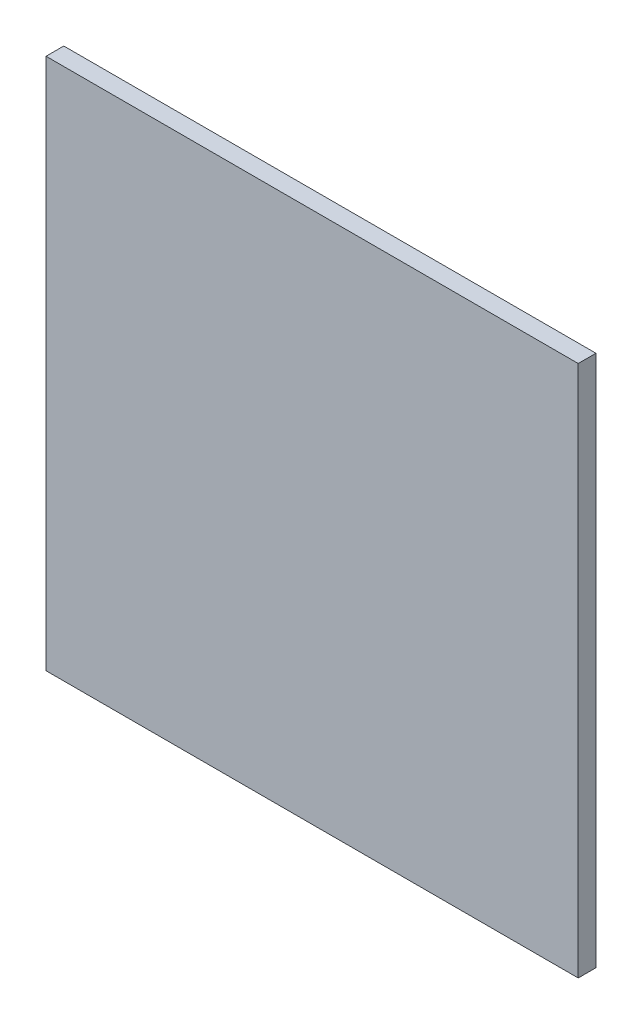
ISO-10303-21;
HEADER;
FILE_DESCRIPTION(('STEP AP214'),'2;1');
FILE_NAME('part.step','',(''),(''),'','','');
FILE_SCHEMA(('AUTOMOTIVE_DESIGN { 1 0 10303 214 1 1 1 1 }'));
ENDSEC;
DATA;
#1=APPLICATION_CONTEXT('core data for automotive mechanical design processes');
#2=APPLICATION_PROTOCOL_DEFINITION('international standard','automotive_design',2000,#1);
#3=PRODUCT_CONTEXT('',#1,'mechanical');
#4=PRODUCT('Part','Part','',(#3));
#5=PRODUCT_RELATED_PRODUCT_CATEGORY('part','',(#4));
#6=PRODUCT_DEFINITION_FORMATION('','',#4);
#7=PRODUCT_DEFINITION_CONTEXT('part definition',#1,'design');
#8=PRODUCT_DEFINITION('design','',#6,#7);
#9=PRODUCT_DEFINITION_SHAPE('','',#8);
#10=(LENGTH_UNIT() NAMED_UNIT(*) SI_UNIT(.MILLI.,.METRE.));
#11=(NAMED_UNIT(*) PLANE_ANGLE_UNIT() SI_UNIT($,.RADIAN.));
#12=(NAMED_UNIT(*) SI_UNIT($,.STERADIAN.) SOLID_ANGLE_UNIT());
#13=UNCERTAINTY_MEASURE_WITH_UNIT(LENGTH_MEASURE(1.E-05),#10,'distance_accuracy_value','');
#14=(GEOMETRIC_REPRESENTATION_CONTEXT(3) GLOBAL_UNCERTAINTY_ASSIGNED_CONTEXT((#13)) GLOBAL_UNIT_ASSIGNED_CONTEXT((#10,
#11,#12)) REPRESENTATION_CONTEXT('',''));
#15=CARTESIAN_POINT('',(0.,0.,0.));
#16=DIRECTION('',(0.,0.,1.));
#17=DIRECTION('',(1.,0.,0.));
#18=AXIS2_PLACEMENT_3D('',#15,#16,#17);
#19=CARTESIAN_POINT('',(30.,0.,0.));
#20=DIRECTION('',(-1.,0.,0.));
#21=DIRECTION('',(0.,1.,0.));
#22=AXIS2_PLACEMENT_3D('',#19,#20,#21);
#23=PLANE('',#22);
#24=DIRECTION('',(0.,0.,1.));
#25=VECTOR('',#24,1.);
#26=CARTESIAN_POINT('',(30.,0.,0.));
#27=LINE('',#26,#25);
#28=CARTESIAN_POINT('',(30.,0.,0.));
#29=VERTEX_POINT('',#28);
#30=CARTESIAN_POINT('',(30.,0.,1.));
#31=VERTEX_POINT('',#30);
#32=EDGE_CURVE('E11',#29,#31,#27,.T.);
#33=ORIENTED_EDGE('',*,*,#32,.F.);
#34=DIRECTION('',(0.,1.,0.));
#35=VECTOR('',#34,1.);
#36=CARTESIAN_POINT('',(30.,0.,0.));
#37=LINE('',#36,#35);
#38=CARTESIAN_POINT('',(30.,30.,0.));
#39=VERTEX_POINT('',#38);
#40=EDGE_CURVE('E90',#29,#39,#37,.T.);
#41=ORIENTED_EDGE('',*,*,#40,.T.);
#42=DIRECTION('',(0.,0.,1.));
#43=VECTOR('',#42,1.);
#44=CARTESIAN_POINT('',(30.,30.,0.));
#45=LINE('',#44,#43);
#46=CARTESIAN_POINT('',(30.,30.,1.));
#47=VERTEX_POINT('',#46);
#48=EDGE_CURVE('E45',#39,#47,#45,.T.);
#49=ORIENTED_EDGE('',*,*,#48,.T.);
#50=DIRECTION('',(0.,1.,0.));
#51=VECTOR('',#50,1.);
#52=CARTESIAN_POINT('',(30.,0.,1.));
#53=LINE('',#52,#51);
#54=EDGE_CURVE('E100',#31,#47,#53,.T.);
#55=ORIENTED_EDGE('',*,*,#54,.F.);
#56=EDGE_LOOP('',(#33,#41,#49,#55));
#57=FACE_BOUND('',#56,.T.);
#58=ADVANCED_FACE('F35',(#57),#23,.F.);
#59=CARTESIAN_POINT('',(0.,30.,0.));
#60=DIRECTION('',(0.,-1.,0.));
#61=DIRECTION('',(-1.,0.,0.));
#62=AXIS2_PLACEMENT_3D('',#59,#60,#61);
#63=PLANE('',#62);
#64=ORIENTED_EDGE('',*,*,#48,.F.);
#65=DIRECTION('',(-1.,0.,0.));
#66=VECTOR('',#65,1.);
#67=CARTESIAN_POINT('',(0.,30.,0.));
#68=LINE('',#67,#66);
#69=CARTESIAN_POINT('',(0.,30.,0.));
#70=VERTEX_POINT('',#69);
#71=EDGE_CURVE('E85',#39,#70,#68,.T.);
#72=ORIENTED_EDGE('',*,*,#71,.T.);
#73=DIRECTION('',(0.,0.,1.));
#74=VECTOR('',#73,1.);
#75=CARTESIAN_POINT('',(0.,30.,0.));
#76=LINE('',#75,#74);
#77=CARTESIAN_POINT('',(0.,30.,1.));
#78=VERTEX_POINT('',#77);
#79=EDGE_CURVE('E53',#70,#78,#76,.T.);
#80=ORIENTED_EDGE('',*,*,#79,.T.);
#81=DIRECTION('',(-1.,0.,0.));
#82=VECTOR('',#81,1.);
#83=CARTESIAN_POINT('',(0.,30.,1.));
#84=LINE('',#83,#82);
#85=EDGE_CURVE('E104',#47,#78,#84,.T.);
#86=ORIENTED_EDGE('',*,*,#85,.F.);
#87=EDGE_LOOP('',(#64,#72,#80,#86));
#88=FACE_BOUND('',#87,.T.);
#89=ADVANCED_FACE('F89',(#88),#63,.F.);
#90=CARTESIAN_POINT('',(0.,0.,0.));
#91=DIRECTION('',(1.,0.,0.));
#92=DIRECTION('',(0.,-1.,0.));
#93=AXIS2_PLACEMENT_3D('',#90,#91,#92);
#94=PLANE('',#93);
#95=ORIENTED_EDGE('',*,*,#79,.F.);
#96=DIRECTION('',(0.,-1.,0.));
#97=VECTOR('',#96,1.);
#98=CARTESIAN_POINT('',(0.,0.,0.));
#99=LINE('',#98,#97);
#100=CARTESIAN_POINT('',(0.,0.,0.));
#101=VERTEX_POINT('',#100);
#102=EDGE_CURVE('E75',#70,#101,#99,.T.);
#103=ORIENTED_EDGE('',*,*,#102,.T.);
#104=DIRECTION('',(0.,0.,1.));
#105=VECTOR('',#104,1.);
#106=CARTESIAN_POINT('',(0.,0.,0.));
#107=LINE('',#106,#105);
#108=CARTESIAN_POINT('',(0.,0.,1.));
#109=VERTEX_POINT('',#108);
#110=EDGE_CURVE('E39',#101,#109,#107,.T.);
#111=ORIENTED_EDGE('',*,*,#110,.T.);
#112=DIRECTION('',(0.,1.,0.));
#113=VECTOR('',#112,1.);
#114=CARTESIAN_POINT('',(0.,0.,1.));
#115=LINE('',#114,#113);
#116=EDGE_CURVE('E77',#78,#109,#115,.F.);
#117=ORIENTED_EDGE('',*,*,#116,.F.);
#118=EDGE_LOOP('',(#95,#103,#111,#117));
#119=FACE_BOUND('',#118,.T.);
#120=ADVANCED_FACE('F74',(#119),#94,.F.);
#121=CARTESIAN_POINT('',(0.,0.,0.));
#122=DIRECTION('',(0.,1.,0.));
#123=DIRECTION('',(1.,0.,0.));
#124=AXIS2_PLACEMENT_3D('',#121,#122,#123);
#125=PLANE('',#124);
#126=DIRECTION('',(1.,0.,0.));
#127=VECTOR('',#126,1.);
#128=CARTESIAN_POINT('',(0.,0.,0.));
#129=LINE('',#128,#127);
#130=EDGE_CURVE('E87',#101,#29,#129,.T.);
#131=ORIENTED_EDGE('',*,*,#130,.T.);
#132=ORIENTED_EDGE('',*,*,#32,.T.);
#133=DIRECTION('',(-1.,0.,0.));
#134=VECTOR('',#133,1.);
#135=CARTESIAN_POINT('',(0.,0.,1.));
#136=LINE('',#135,#134);
#137=EDGE_CURVE('E92',#109,#31,#136,.F.);
#138=ORIENTED_EDGE('',*,*,#137,.F.);
#139=ORIENTED_EDGE('',*,*,#110,.F.);
#140=EDGE_LOOP('',(#131,#132,#138,#139));
#141=FACE_BOUND('',#140,.T.);
#142=ADVANCED_FACE('F37',(#141),#125,.F.);
#143=CARTESIAN_POINT('',(0.,0.,1.));
#144=DIRECTION('',(0.,0.,-1.));
#145=DIRECTION('',(-1.,0.,0.));
#146=AXIS2_PLACEMENT_3D('',#143,#144,#145);
#147=PLANE('',#146);
#148=ORIENTED_EDGE('',*,*,#116,.T.);
#149=ORIENTED_EDGE('',*,*,#137,.T.);
#150=ORIENTED_EDGE('',*,*,#54,.T.);
#151=ORIENTED_EDGE('',*,*,#85,.T.);
#152=EDGE_LOOP('',(#148,#149,#150,#151));
#153=FACE_BOUND('',#152,.T.);
#154=ADVANCED_FACE('F103',(#153),#147,.F.);
#155=CARTESIAN_POINT('',(0.,0.,0.));
#156=DIRECTION('',(0.,0.,-1.));
#157=DIRECTION('',(-1.,0.,0.));
#158=AXIS2_PLACEMENT_3D('',#155,#156,#157);
#159=PLANE('',#158);
#160=ORIENTED_EDGE('',*,*,#102,.F.);
#161=ORIENTED_EDGE('',*,*,#71,.F.);
#162=ORIENTED_EDGE('',*,*,#40,.F.);
#163=ORIENTED_EDGE('',*,*,#130,.F.);
#164=EDGE_LOOP('',(#160,#161,#162,#163));
#165=FACE_BOUND('',#164,.T.);
#166=ADVANCED_FACE('F83',(#165),#159,.T.);
#167=CLOSED_SHELL('',(#58,#89,#120,#142,#154,#166));
#168=MANIFOLD_SOLID_BREP('B2',#167);
#169=ADVANCED_BREP_SHAPE_REPRESENTATION('',(#18,#168),#14);
#170=SHAPE_DEFINITION_REPRESENTATION(#9,#169);
ENDSEC;
END-ISO-10303-21;
